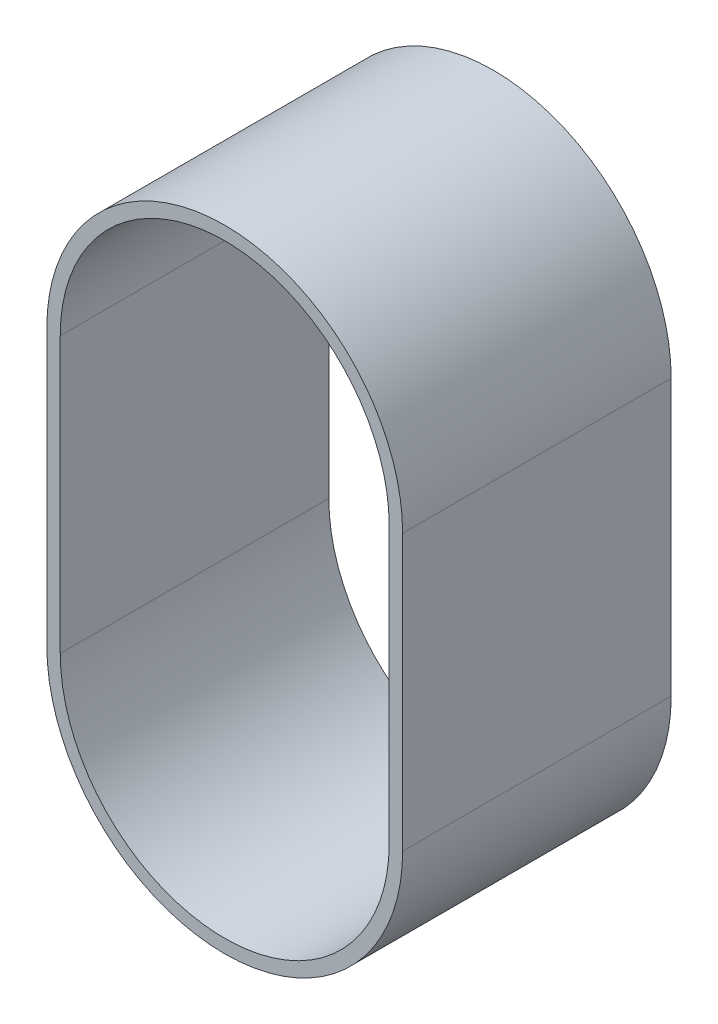
ISO-10303-21;
HEADER;
FILE_DESCRIPTION(('STEP AP214'),'2;1');
FILE_NAME('part.step','',(''),(''),'','','');
FILE_SCHEMA(('AUTOMOTIVE_DESIGN { 1 0 10303 214 1 1 1 1 }'));
ENDSEC;
DATA;
#1=APPLICATION_CONTEXT('core data for automotive mechanical design processes');
#2=APPLICATION_PROTOCOL_DEFINITION('international standard','automotive_design',2000,#1);
#3=PRODUCT_CONTEXT('',#1,'mechanical');
#4=PRODUCT('Part','Part','',(#3));
#5=PRODUCT_RELATED_PRODUCT_CATEGORY('part','',(#4));
#6=PRODUCT_DEFINITION_FORMATION('','',#4);
#7=PRODUCT_DEFINITION_CONTEXT('part definition',#1,'design');
#8=PRODUCT_DEFINITION('design','',#6,#7);
#9=PRODUCT_DEFINITION_SHAPE('','',#8);
#10=(LENGTH_UNIT() NAMED_UNIT(*) SI_UNIT(.MILLI.,.METRE.));
#11=(NAMED_UNIT(*) PLANE_ANGLE_UNIT() SI_UNIT($,.RADIAN.));
#12=(NAMED_UNIT(*) SI_UNIT($,.STERADIAN.) SOLID_ANGLE_UNIT());
#13=UNCERTAINTY_MEASURE_WITH_UNIT(LENGTH_MEASURE(1.E-05),#10,'distance_accuracy_value','');
#14=(GEOMETRIC_REPRESENTATION_CONTEXT(3) GLOBAL_UNCERTAINTY_ASSIGNED_CONTEXT((#13)) GLOBAL_UNIT_ASSIGNED_CONTEXT((#10,
#11,#12)) REPRESENTATION_CONTEXT('',''));
#15=CARTESIAN_POINT('',(0.,0.,0.));
#16=DIRECTION('',(0.,0.,1.));
#17=DIRECTION('',(1.,0.,0.));
#18=AXIS2_PLACEMENT_3D('',#15,#16,#17);
#19=CARTESIAN_POINT('',(-2.88620795061788,-6.03673923854262,20.));
#20=DIRECTION('',(0.,0.,1.));
#21=DIRECTION('',(1.,0.,0.));
#22=AXIS2_PLACEMENT_3D('',#19,#20,#21);
#23=PLANE('',#22);
#24=CARTESIAN_POINT('',(-2.88620795061788,-6.03673923854262,20.));
#25=DIRECTION('',(0.,0.,1.));
#26=DIRECTION('',(1.,0.,0.));
#27=AXIS2_PLACEMENT_3D('',#24,#25,#26);
#28=CIRCLE('',#27,13.25);
#29=CARTESIAN_POINT('',(10.3637920493821,-6.03673923854262,20.));
#30=VERTEX_POINT('',#29);
#31=CARTESIAN_POINT('',(-16.1362079506179,-6.03673923854262,20.));
#32=VERTEX_POINT('',#31);
#33=EDGE_CURVE('E138',#30,#32,#28,.T.);
#34=ORIENTED_EDGE('',*,*,#33,.T.);
#35=DIRECTION('',(0.,-1.,0.));
#36=VECTOR('',#35,1.);
#37=CARTESIAN_POINT('',(-16.1362079506179,-6.03673923854262,20.));
#38=LINE('',#37,#36);
#39=CARTESIAN_POINT('',(-16.1362079506179,-26.5367392385426,20.));
#40=VERTEX_POINT('',#39);
#41=EDGE_CURVE('E141',#32,#40,#38,.T.);
#42=ORIENTED_EDGE('',*,*,#41,.T.);
#43=CARTESIAN_POINT('',(-2.88620795061788,-26.5367392385426,20.));
#44=DIRECTION('',(0.,0.,1.));
#45=DIRECTION('',(1.,0.,0.));
#46=AXIS2_PLACEMENT_3D('',#43,#44,#45);
#47=CIRCLE('',#46,13.25);
#48=CARTESIAN_POINT('',(10.3637920493821,-26.5367392385426,20.));
#49=VERTEX_POINT('',#48);
#50=EDGE_CURVE('E144',#40,#49,#47,.T.);
#51=ORIENTED_EDGE('',*,*,#50,.T.);
#52=DIRECTION('',(0.,1.,0.));
#53=VECTOR('',#52,1.);
#54=CARTESIAN_POINT('',(10.3637920493821,-6.03673923854262,20.));
#55=LINE('',#54,#53);
#56=EDGE_CURVE('E146',#49,#30,#55,.T.);
#57=ORIENTED_EDGE('',*,*,#56,.T.);
#58=EDGE_LOOP('',(#34,#42,#51,#57));
#59=FACE_BOUND('',#58,.T.);
#60=DIRECTION('',(0.,-1.,0.));
#61=VECTOR('',#60,1.);
#62=CARTESIAN_POINT('',(-15.1362079506179,-6.03673923854262,20.));
#63=LINE('',#62,#61);
#64=CARTESIAN_POINT('',(-15.1362079506179,-6.03673923854262,20.));
#65=VERTEX_POINT('',#64);
#66=CARTESIAN_POINT('',(-15.1362079506179,-26.5367392385426,20.));
#67=VERTEX_POINT('',#66);
#68=EDGE_CURVE('E110',#65,#67,#63,.T.);
#69=ORIENTED_EDGE('',*,*,#68,.F.);
#70=CARTESIAN_POINT('',(-2.88620795061788,-6.03673923854262,20.));
#71=DIRECTION('',(0.,0.,1.));
#72=DIRECTION('',(1.,0.,0.));
#73=AXIS2_PLACEMENT_3D('',#70,#71,#72);
#74=CIRCLE('',#73,12.25);
#75=CARTESIAN_POINT('',(9.36379204938211,-6.03673923854262,20.));
#76=VERTEX_POINT('',#75);
#77=EDGE_CURVE('E102',#76,#65,#74,.T.);
#78=ORIENTED_EDGE('',*,*,#77,.F.);
#79=DIRECTION('',(0.,1.,0.));
#80=VECTOR('',#79,1.);
#81=CARTESIAN_POINT('',(9.36379204938211,-6.03673923854262,20.));
#82=LINE('',#81,#80);
#83=CARTESIAN_POINT('',(9.36379204938211,-26.5367392385426,20.));
#84=VERTEX_POINT('',#83);
#85=EDGE_CURVE('E124',#84,#76,#82,.T.);
#86=ORIENTED_EDGE('',*,*,#85,.F.);
#87=CARTESIAN_POINT('',(-2.88620795061788,-26.5367392385426,20.));
#88=DIRECTION('',(0.,0.,1.));
#89=DIRECTION('',(1.,0.,0.));
#90=AXIS2_PLACEMENT_3D('',#87,#88,#89);
#91=CIRCLE('',#90,12.25);
#92=EDGE_CURVE('E122',#67,#84,#91,.T.);
#93=ORIENTED_EDGE('',*,*,#92,.F.);
#94=EDGE_LOOP('',(#69,#78,#86,#93));
#95=FACE_BOUND('',#94,.T.);
#96=ADVANCED_FACE('F37',(#59,#95),#23,.T.);
#97=CARTESIAN_POINT('',(-2.88620795061788,-6.03673923854262,0.));
#98=DIRECTION('',(0.,0.,1.));
#99=DIRECTION('',(1.,0.,0.));
#100=AXIS2_PLACEMENT_3D('',#97,#98,#99);
#101=PLANE('',#100);
#102=CARTESIAN_POINT('',(-2.88620795061788,-6.03673923854262,0.));
#103=DIRECTION('',(0.,0.,1.));
#104=DIRECTION('',(1.,0.,0.));
#105=AXIS2_PLACEMENT_3D('',#102,#103,#104);
#106=CIRCLE('',#105,13.25);
#107=CARTESIAN_POINT('',(10.3637920493821,-6.03673923854262,0.));
#108=VERTEX_POINT('',#107);
#109=CARTESIAN_POINT('',(-16.1362079506179,-6.03673923854262,0.));
#110=VERTEX_POINT('',#109);
#111=EDGE_CURVE('E118',#108,#110,#106,.T.);
#112=ORIENTED_EDGE('',*,*,#111,.F.);
#113=DIRECTION('',(0.,1.,0.));
#114=VECTOR('',#113,1.);
#115=CARTESIAN_POINT('',(10.3637920493821,-6.03673923854262,0.));
#116=LINE('',#115,#114);
#117=CARTESIAN_POINT('',(10.3637920493821,-26.5367392385426,0.));
#118=VERTEX_POINT('',#117);
#119=EDGE_CURVE('E142',#118,#108,#116,.T.);
#120=ORIENTED_EDGE('',*,*,#119,.F.);
#121=CARTESIAN_POINT('',(-2.88620795061788,-26.5367392385426,0.));
#122=DIRECTION('',(0.,0.,1.));
#123=DIRECTION('',(1.,0.,0.));
#124=AXIS2_PLACEMENT_3D('',#121,#122,#123);
#125=CIRCLE('',#124,13.25);
#126=CARTESIAN_POINT('',(-16.1362079506179,-26.5367392385426,0.));
#127=VERTEX_POINT('',#126);
#128=EDGE_CURVE('E153',#127,#118,#125,.T.);
#129=ORIENTED_EDGE('',*,*,#128,.F.);
#130=DIRECTION('',(0.,-1.,0.));
#131=VECTOR('',#130,1.);
#132=CARTESIAN_POINT('',(-16.1362079506179,-6.03673923854262,0.));
#133=LINE('',#132,#131);
#134=EDGE_CURVE('E151',#110,#127,#133,.T.);
#135=ORIENTED_EDGE('',*,*,#134,.F.);
#136=EDGE_LOOP('',(#112,#120,#129,#135));
#137=FACE_BOUND('',#136,.T.);
#138=CARTESIAN_POINT('',(-2.88620795061788,-6.03673923854262,0.));
#139=DIRECTION('',(0.,0.,1.));
#140=DIRECTION('',(1.,0.,0.));
#141=AXIS2_PLACEMENT_3D('',#138,#139,#140);
#142=CIRCLE('',#141,12.25);
#143=CARTESIAN_POINT('',(9.36379204938211,-6.03673923854262,0.));
#144=VERTEX_POINT('',#143);
#145=CARTESIAN_POINT('',(-15.1362079506179,-6.03673923854262,0.));
#146=VERTEX_POINT('',#145);
#147=EDGE_CURVE('E60',#144,#146,#142,.T.);
#148=ORIENTED_EDGE('',*,*,#147,.T.);
#149=DIRECTION('',(0.,-1.,0.));
#150=VECTOR('',#149,1.);
#151=CARTESIAN_POINT('',(-15.1362079506179,-6.03673923854262,0.));
#152=LINE('',#151,#150);
#153=CARTESIAN_POINT('',(-15.1362079506179,-26.5367392385426,0.));
#154=VERTEX_POINT('',#153);
#155=EDGE_CURVE('E117',#146,#154,#152,.T.);
#156=ORIENTED_EDGE('',*,*,#155,.T.);
#157=CARTESIAN_POINT('',(-2.88620795061788,-26.5367392385426,0.));
#158=DIRECTION('',(0.,0.,1.));
#159=DIRECTION('',(1.,0.,0.));
#160=AXIS2_PLACEMENT_3D('',#157,#158,#159);
#161=CIRCLE('',#160,12.25);
#162=CARTESIAN_POINT('',(9.36379204938211,-26.5367392385426,0.));
#163=VERTEX_POINT('',#162);
#164=EDGE_CURVE('E130',#154,#163,#161,.T.);
#165=ORIENTED_EDGE('',*,*,#164,.T.);
#166=DIRECTION('',(0.,1.,0.));
#167=VECTOR('',#166,1.);
#168=CARTESIAN_POINT('',(9.36379204938211,-6.03673923854262,0.));
#169=LINE('',#168,#167);
#170=EDGE_CURVE('E111',#163,#144,#169,.T.);
#171=ORIENTED_EDGE('',*,*,#170,.T.);
#172=EDGE_LOOP('',(#148,#156,#165,#171));
#173=FACE_BOUND('',#172,.T.);
#174=ADVANCED_FACE('F171',(#137,#173),#101,.F.);
#175=CARTESIAN_POINT('',(-2.88620795061788,-6.03673923854262,20.));
#176=DIRECTION('',(0.,0.,-1.));
#177=DIRECTION('',(-1.,0.,0.));
#178=AXIS2_PLACEMENT_3D('',#175,#176,#177);
#179=CYLINDRICAL_SURFACE('',#178,13.25);
#180=ORIENTED_EDGE('',*,*,#111,.T.);
#181=DIRECTION('',(0.,0.,-1.));
#182=VECTOR('',#181,1.);
#183=CARTESIAN_POINT('',(-16.1362079506179,-6.03673923854262,20.));
#184=LINE('',#183,#182);
#185=EDGE_CURVE('E11',#32,#110,#184,.T.);
#186=ORIENTED_EDGE('',*,*,#185,.F.);
#187=ORIENTED_EDGE('',*,*,#33,.F.);
#188=DIRECTION('',(0.,0.,-1.));
#189=VECTOR('',#188,1.);
#190=CARTESIAN_POINT('',(10.3637920493821,-6.03673923854262,20.));
#191=LINE('',#190,#189);
#192=EDGE_CURVE('E148',#30,#108,#191,.T.);
#193=ORIENTED_EDGE('',*,*,#192,.T.);
#194=EDGE_LOOP('',(#180,#186,#187,#193));
#195=FACE_BOUND('',#194,.T.);
#196=ADVANCED_FACE('F39',(#195),#179,.T.);
#197=CARTESIAN_POINT('',(-16.1362079506179,-6.03673923854262,20.));
#198=DIRECTION('',(1.,0.,0.));
#199=DIRECTION('',(0.,0.,-1.));
#200=AXIS2_PLACEMENT_3D('',#197,#198,#199);
#201=PLANE('',#200);
#202=ORIENTED_EDGE('',*,*,#134,.T.);
#203=DIRECTION('',(0.,0.,-1.));
#204=VECTOR('',#203,1.);
#205=CARTESIAN_POINT('',(-16.1362079506179,-26.5367392385426,20.));
#206=LINE('',#205,#204);
#207=EDGE_CURVE('E45',#40,#127,#206,.T.);
#208=ORIENTED_EDGE('',*,*,#207,.F.);
#209=ORIENTED_EDGE('',*,*,#41,.F.);
#210=ORIENTED_EDGE('',*,*,#185,.T.);
#211=EDGE_LOOP('',(#202,#208,#209,#210));
#212=FACE_BOUND('',#211,.T.);
#213=ADVANCED_FACE('F181',(#212),#201,.F.);
#214=CARTESIAN_POINT('',(-2.88620795061788,-26.5367392385426,20.));
#215=DIRECTION('',(0.,0.,-1.));
#216=DIRECTION('',(-1.,0.,0.));
#217=AXIS2_PLACEMENT_3D('',#214,#215,#216);
#218=CYLINDRICAL_SURFACE('',#217,13.25);
#219=ORIENTED_EDGE('',*,*,#128,.T.);
#220=DIRECTION('',(0.,0.,-1.));
#221=VECTOR('',#220,1.);
#222=CARTESIAN_POINT('',(10.3637920493821,-26.5367392385426,20.));
#223=LINE('',#222,#221);
#224=EDGE_CURVE('E158',#49,#118,#223,.T.);
#225=ORIENTED_EDGE('',*,*,#224,.F.);
#226=ORIENTED_EDGE('',*,*,#50,.F.);
#227=ORIENTED_EDGE('',*,*,#207,.T.);
#228=EDGE_LOOP('',(#219,#225,#226,#227));
#229=FACE_BOUND('',#228,.T.);
#230=ADVANCED_FACE('F165',(#229),#218,.T.);
#231=CARTESIAN_POINT('',(10.3637920493821,-6.03673923854262,20.));
#232=DIRECTION('',(-1.,0.,0.));
#233=DIRECTION('',(0.,0.,1.));
#234=AXIS2_PLACEMENT_3D('',#231,#232,#233);
#235=PLANE('',#234);
#236=ORIENTED_EDGE('',*,*,#119,.T.);
#237=ORIENTED_EDGE('',*,*,#192,.F.);
#238=ORIENTED_EDGE('',*,*,#56,.F.);
#239=ORIENTED_EDGE('',*,*,#224,.T.);
#240=EDGE_LOOP('',(#236,#237,#238,#239));
#241=FACE_BOUND('',#240,.T.);
#242=ADVANCED_FACE('F175',(#241),#235,.F.);
#243=CARTESIAN_POINT('',(-2.88620795061788,-6.03673923854262,20.));
#244=DIRECTION('',(0.,0.,-1.));
#245=DIRECTION('',(-1.,0.,0.));
#246=AXIS2_PLACEMENT_3D('',#243,#244,#245);
#247=CYLINDRICAL_SURFACE('',#246,12.25);
#248=ORIENTED_EDGE('',*,*,#147,.F.);
#249=DIRECTION('',(0.,0.,-1.));
#250=VECTOR('',#249,1.);
#251=CARTESIAN_POINT('',(9.36379204938211,-6.03673923854262,20.));
#252=LINE('',#251,#250);
#253=EDGE_CURVE('E106',#76,#144,#252,.T.);
#254=ORIENTED_EDGE('',*,*,#253,.F.);
#255=ORIENTED_EDGE('',*,*,#77,.T.);
#256=DIRECTION('',(0.,0.,-1.));
#257=VECTOR('',#256,1.);
#258=CARTESIAN_POINT('',(-15.1362079506179,-6.03673923854262,20.));
#259=LINE('',#258,#257);
#260=EDGE_CURVE('E105',#65,#146,#259,.T.);
#261=ORIENTED_EDGE('',*,*,#260,.T.);
#262=EDGE_LOOP('',(#248,#254,#255,#261));
#263=FACE_BOUND('',#262,.T.);
#264=ADVANCED_FACE('F104',(#263),#247,.F.);
#265=CARTESIAN_POINT('',(-15.1362079506179,-6.03673923854262,20.));
#266=DIRECTION('',(1.,0.,0.));
#267=DIRECTION('',(0.,1.,0.));
#268=AXIS2_PLACEMENT_3D('',#265,#266,#267);
#269=PLANE('',#268);
#270=ORIENTED_EDGE('',*,*,#155,.F.);
#271=ORIENTED_EDGE('',*,*,#260,.F.);
#272=ORIENTED_EDGE('',*,*,#68,.T.);
#273=DIRECTION('',(0.,0.,-1.));
#274=VECTOR('',#273,1.);
#275=CARTESIAN_POINT('',(-15.1362079506179,-26.5367392385426,20.));
#276=LINE('',#275,#274);
#277=EDGE_CURVE('E119',#67,#154,#276,.T.);
#278=ORIENTED_EDGE('',*,*,#277,.T.);
#279=EDGE_LOOP('',(#270,#271,#272,#278));
#280=FACE_BOUND('',#279,.T.);
#281=ADVANCED_FACE('F114',(#280),#269,.T.);
#282=CARTESIAN_POINT('',(-2.88620795061788,-26.5367392385426,20.));
#283=DIRECTION('',(0.,0.,-1.));
#284=DIRECTION('',(-1.,0.,0.));
#285=AXIS2_PLACEMENT_3D('',#282,#283,#284);
#286=CYLINDRICAL_SURFACE('',#285,12.25);
#287=ORIENTED_EDGE('',*,*,#164,.F.);
#288=ORIENTED_EDGE('',*,*,#277,.F.);
#289=ORIENTED_EDGE('',*,*,#92,.T.);
#290=DIRECTION('',(0.,0.,-1.));
#291=VECTOR('',#290,1.);
#292=CARTESIAN_POINT('',(9.36379204938211,-26.5367392385426,20.));
#293=LINE('',#292,#291);
#294=EDGE_CURVE('E52',#84,#163,#293,.T.);
#295=ORIENTED_EDGE('',*,*,#294,.T.);
#296=EDGE_LOOP('',(#287,#288,#289,#295));
#297=FACE_BOUND('',#296,.T.);
#298=ADVANCED_FACE('F204',(#297),#286,.F.);
#299=CARTESIAN_POINT('',(9.36379204938211,-6.03673923854262,20.));
#300=DIRECTION('',(-1.,0.,0.));
#301=DIRECTION('',(0.,0.,1.));
#302=AXIS2_PLACEMENT_3D('',#299,#300,#301);
#303=PLANE('',#302);
#304=ORIENTED_EDGE('',*,*,#170,.F.);
#305=ORIENTED_EDGE('',*,*,#294,.F.);
#306=ORIENTED_EDGE('',*,*,#85,.T.);
#307=ORIENTED_EDGE('',*,*,#253,.T.);
#308=EDGE_LOOP('',(#304,#305,#306,#307));
#309=FACE_BOUND('',#308,.T.);
#310=ADVANCED_FACE('F208',(#309),#303,.T.);
#311=CLOSED_SHELL('',(#96,#174,#196,#213,#230,#242,#264,#281,#298,#310));
#312=MANIFOLD_SOLID_BREP('B2',#311);
#313=ADVANCED_BREP_SHAPE_REPRESENTATION('',(#18,#312),#14);
#314=SHAPE_DEFINITION_REPRESENTATION(#9,#313);
ENDSEC;
END-ISO-10303-21;
